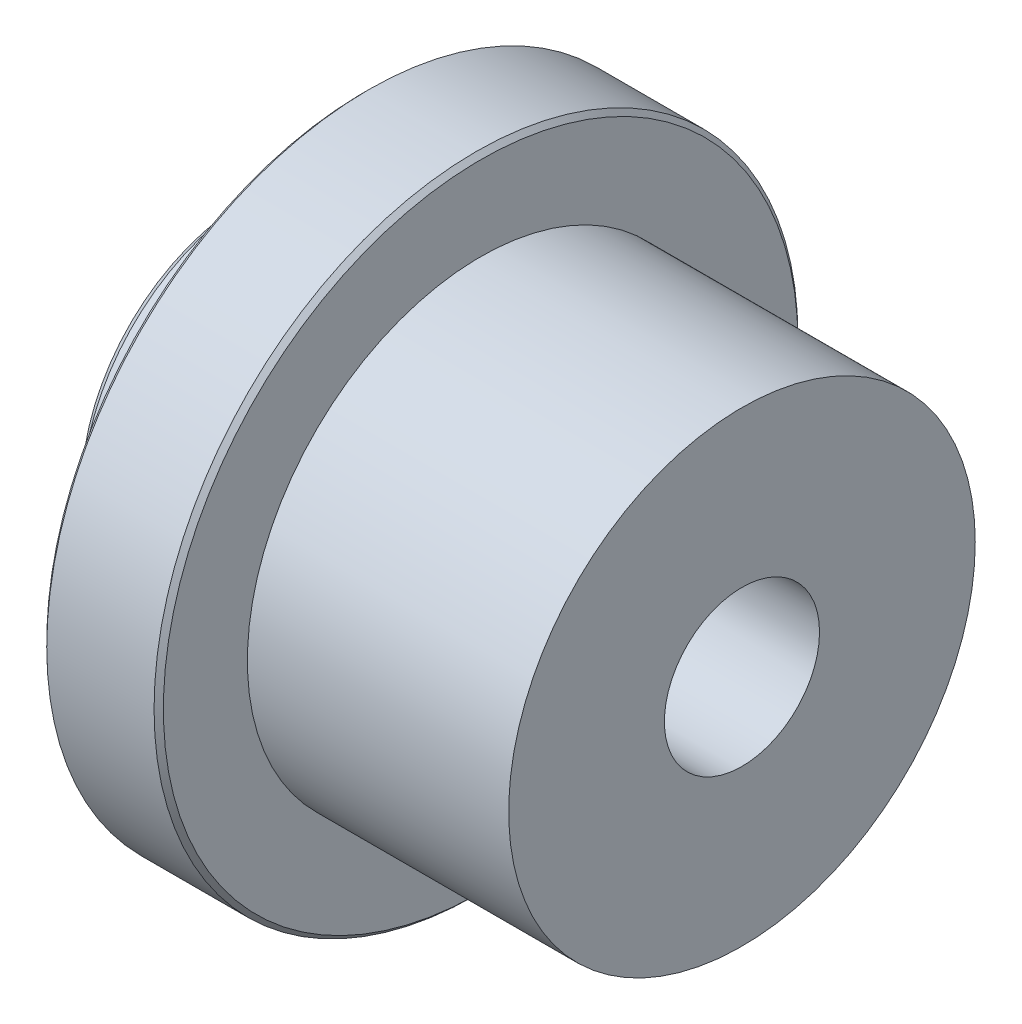
ISO-10303-21;
HEADER;
FILE_DESCRIPTION(('STEP AP214'),'2;1');
FILE_NAME('part.step','',(''),(''),'','','');
FILE_SCHEMA(('AUTOMOTIVE_DESIGN { 1 0 10303 214 1 1 1 1 }'));
ENDSEC;
DATA;
#1=APPLICATION_CONTEXT('core data for automotive mechanical design processes');
#2=APPLICATION_PROTOCOL_DEFINITION('international standard','automotive_design',2000,#1);
#3=PRODUCT_CONTEXT('',#1,'mechanical');
#4=PRODUCT('Part','Part','',(#3));
#5=PRODUCT_RELATED_PRODUCT_CATEGORY('part','',(#4));
#6=PRODUCT_DEFINITION_FORMATION('','',#4);
#7=PRODUCT_DEFINITION_CONTEXT('part definition',#1,'design');
#8=PRODUCT_DEFINITION('design','',#6,#7);
#9=PRODUCT_DEFINITION_SHAPE('','',#8);
#10=(LENGTH_UNIT() NAMED_UNIT(*) SI_UNIT(.MILLI.,.METRE.));
#11=(NAMED_UNIT(*) PLANE_ANGLE_UNIT() SI_UNIT($,.RADIAN.));
#12=(NAMED_UNIT(*) SI_UNIT($,.STERADIAN.) SOLID_ANGLE_UNIT());
#13=UNCERTAINTY_MEASURE_WITH_UNIT(LENGTH_MEASURE(1.E-05),#10,'distance_accuracy_value','');
#14=(GEOMETRIC_REPRESENTATION_CONTEXT(3) GLOBAL_UNCERTAINTY_ASSIGNED_CONTEXT((#13)) GLOBAL_UNIT_ASSIGNED_CONTEXT((#10,
#11,#12)) REPRESENTATION_CONTEXT('',''));
#15=CARTESIAN_POINT('',(0.,0.,0.));
#16=DIRECTION('',(0.,0.,1.));
#17=DIRECTION('',(1.,0.,0.));
#18=AXIS2_PLACEMENT_3D('',#15,#16,#17);
#19=CARTESIAN_POINT('',(6.35,0.,0.));
#20=DIRECTION('',(1.,0.,0.));
#21=DIRECTION('',(0.,0.,-1.));
#22=AXIS2_PLACEMENT_3D('',#19,#20,#21);
#23=PLANE('',#22);
#24=CARTESIAN_POINT('',(6.35,0.,0.));
#25=DIRECTION('',(1.,0.,0.));
#26=DIRECTION('',(0.,0.,-1.));
#27=AXIS2_PLACEMENT_3D('',#24,#25,#26);
#28=CIRCLE('',#27,12.7);
#29=CARTESIAN_POINT('',(6.35,0.,-12.7));
#30=VERTEX_POINT('',#29);
#31=EDGE_CURVE('E10',#30,#30,#28,.T.);
#32=ORIENTED_EDGE('',*,*,#31,.F.);
#33=EDGE_LOOP('',(#32));
#34=FACE_BOUND('',#33,.T.);
#35=CARTESIAN_POINT('',(6.35,0.,0.));
#36=DIRECTION('',(1.,0.,0.));
#37=DIRECTION('',(0.,0.,-1.));
#38=AXIS2_PLACEMENT_3D('',#35,#36,#37);
#39=CIRCLE('',#38,17.272);
#40=CARTESIAN_POINT('',(6.35,0.,-17.272));
#41=VERTEX_POINT('',#40);
#42=EDGE_CURVE('E79',#41,#41,#39,.T.);
#43=ORIENTED_EDGE('',*,*,#42,.T.);
#44=EDGE_LOOP('',(#43));
#45=FACE_BOUND('',#44,.T.);
#46=ADVANCED_FACE('F37',(#34,#45),#23,.T.);
#47=CARTESIAN_POINT('',(0.,0.,0.));
#48=DIRECTION('',(1.,0.,0.));
#49=DIRECTION('',(0.,0.,-1.));
#50=AXIS2_PLACEMENT_3D('',#47,#48,#49);
#51=PLANE('',#50);
#52=CARTESIAN_POINT('',(0.,0.,0.));
#53=DIRECTION('',(1.,0.,0.));
#54=DIRECTION('',(0.,0.,-1.));
#55=AXIS2_PLACEMENT_3D('',#52,#53,#54);
#56=CIRCLE('',#55,10.033);
#57=CARTESIAN_POINT('',(0.,0.,-10.033));
#58=VERTEX_POINT('',#57);
#59=EDGE_CURVE('E57',#58,#58,#56,.T.);
#60=ORIENTED_EDGE('',*,*,#59,.T.);
#61=EDGE_LOOP('',(#60));
#62=FACE_BOUND('',#61,.T.);
#63=CARTESIAN_POINT('',(0.,0.,0.));
#64=DIRECTION('',(1.,0.,0.));
#65=DIRECTION('',(0.,0.,-1.));
#66=AXIS2_PLACEMENT_3D('',#63,#64,#65);
#67=CIRCLE('',#66,17.272);
#68=CARTESIAN_POINT('',(0.,0.,-17.272));
#69=VERTEX_POINT('',#68);
#70=EDGE_CURVE('E95',#69,#69,#67,.F.);
#71=ORIENTED_EDGE('',*,*,#70,.T.);
#72=EDGE_LOOP('',(#71));
#73=FACE_BOUND('',#72,.T.);
#74=ADVANCED_FACE('F177',(#62,#73),#51,.F.);
#75=CARTESIAN_POINT('',(6.35,0.,0.));
#76=DIRECTION('',(-1.,0.,0.));
#77=DIRECTION('',(0.,0.,1.));
#78=AXIS2_PLACEMENT_3D('',#75,#76,#77);
#79=CYLINDRICAL_SURFACE('',#78,17.526);
#80=CARTESIAN_POINT('',(6.09600000000001,0.,0.));
#81=DIRECTION('',(1.,0.,0.));
#82=DIRECTION('',(0.,0.,-1.));
#83=AXIS2_PLACEMENT_3D('',#80,#81,#82);
#84=CIRCLE('',#83,17.526);
#85=CARTESIAN_POINT('',(6.09600000000001,0.,-17.526));
#86=VERTEX_POINT('',#85);
#87=EDGE_CURVE('E91',#86,#86,#84,.F.);
#88=ORIENTED_EDGE('',*,*,#87,.T.);
#89=EDGE_LOOP('',(#88));
#90=FACE_BOUND('',#89,.T.);
#91=CARTESIAN_POINT('',(0.254000000000008,0.,0.));
#92=DIRECTION('',(1.,0.,0.));
#93=DIRECTION('',(0.,0.,-1.));
#94=AXIS2_PLACEMENT_3D('',#91,#92,#93);
#95=CIRCLE('',#94,17.526);
#96=CARTESIAN_POINT('',(0.254000000000008,0.,-17.526));
#97=VERTEX_POINT('',#96);
#98=EDGE_CURVE('E87',#97,#97,#95,.T.);
#99=ORIENTED_EDGE('',*,*,#98,.T.);
#100=EDGE_LOOP('',(#99));
#101=FACE_BOUND('',#100,.T.);
#102=ADVANCED_FACE('F173',(#90,#101),#79,.T.);
#103=CARTESIAN_POINT('',(6.35,0.,0.));
#104=DIRECTION('',(-1.,0.,0.));
#105=DIRECTION('',(0.,0.,1.));
#106=AXIS2_PLACEMENT_3D('',#103,#104,#105);
#107=CYLINDRICAL_SURFACE('',#106,3.96875);
#108=CARTESIAN_POINT('',(6.096,0.,0.));
#109=DIRECTION('',(1.,0.,0.));
#110=DIRECTION('',(0.,0.,-1.));
#111=AXIS2_PLACEMENT_3D('',#108,#109,#110);
#112=CIRCLE('',#111,3.96875);
#113=CARTESIAN_POINT('',(6.096,0.,-3.96875));
#114=VERTEX_POINT('',#113);
#115=EDGE_CURVE('E75',#114,#114,#112,.T.);
#116=ORIENTED_EDGE('',*,*,#115,.T.);
#117=EDGE_LOOP('',(#116));
#118=FACE_BOUND('',#117,.T.);
#119=CARTESIAN_POINT('',(0.254000000000004,0.,0.));
#120=DIRECTION('',(1.,0.,0.));
#121=DIRECTION('',(0.,0.,-1.));
#122=AXIS2_PLACEMENT_3D('',#119,#120,#121);
#123=CIRCLE('',#122,3.96875);
#124=CARTESIAN_POINT('',(0.254000000000004,0.,-3.96875));
#125=VERTEX_POINT('',#124);
#126=EDGE_CURVE('E67',#125,#125,#123,.F.);
#127=ORIENTED_EDGE('',*,*,#126,.T.);
#128=EDGE_LOOP('',(#127));
#129=FACE_BOUND('',#128,.T.);
#130=ADVANCED_FACE('F169',(#118,#129),#107,.F.);
#131=CARTESIAN_POINT('',(6.096,0.,0.));
#132=DIRECTION('',(1.,0.,0.));
#133=DIRECTION('',(0.,0.,-1.));
#134=AXIS2_PLACEMENT_3D('',#131,#132,#133);
#135=CONICAL_SURFACE('',#134,3.96875,0.785398163397448);
#136=CARTESIAN_POINT('',(6.35,0.,0.));
#137=DIRECTION('',(1.,0.,0.));
#138=DIRECTION('',(0.,0.,-1.));
#139=AXIS2_PLACEMENT_3D('',#136,#137,#138);
#140=CIRCLE('',#139,4.22275);
#141=CARTESIAN_POINT('',(6.35,0.,-4.22275));
#142=VERTEX_POINT('',#141);
#143=EDGE_CURVE('E83',#142,#142,#140,.F.);
#144=ORIENTED_EDGE('',*,*,#143,.F.);
#145=EDGE_LOOP('',(#144));
#146=FACE_BOUND('',#145,.T.);
#147=ORIENTED_EDGE('',*,*,#115,.F.);
#148=EDGE_LOOP('',(#147));
#149=FACE_BOUND('',#148,.T.);
#150=ADVANCED_FACE('F172',(#146,#149),#135,.F.);
#151=CARTESIAN_POINT('',(6.35,0.,0.));
#152=DIRECTION('',(-1.,0.,0.));
#153=DIRECTION('',(0.,0.,1.));
#154=AXIS2_PLACEMENT_3D('',#151,#152,#153);
#155=CONICAL_SURFACE('',#154,17.272,0.785398163397455);
#156=ORIENTED_EDGE('',*,*,#87,.F.);
#157=EDGE_LOOP('',(#156));
#158=FACE_BOUND('',#157,.T.);
#159=ORIENTED_EDGE('',*,*,#42,.F.);
#160=EDGE_LOOP('',(#159));
#161=FACE_BOUND('',#160,.T.);
#162=ADVANCED_FACE('F187',(#158,#161),#155,.T.);
#163=CARTESIAN_POINT('',(0.,0.,0.));
#164=DIRECTION('',(-1.,0.,0.));
#165=DIRECTION('',(0.,0.,1.));
#166=AXIS2_PLACEMENT_3D('',#163,#164,#165);
#167=CONICAL_SURFACE('',#166,4.22275,0.785398163397435);
#168=ORIENTED_EDGE('',*,*,#126,.F.);
#169=EDGE_LOOP('',(#168));
#170=FACE_BOUND('',#169,.T.);
#171=CARTESIAN_POINT('',(0.,0.,0.));
#172=DIRECTION('',(1.,0.,0.));
#173=DIRECTION('',(0.,0.,-1.));
#174=AXIS2_PLACEMENT_3D('',#171,#172,#173);
#175=CIRCLE('',#174,4.22275);
#176=CARTESIAN_POINT('',(0.,0.,-4.22275));
#177=VERTEX_POINT('',#176);
#178=EDGE_CURVE('E99',#177,#177,#175,.T.);
#179=ORIENTED_EDGE('',*,*,#178,.F.);
#180=EDGE_LOOP('',(#179));
#181=FACE_BOUND('',#180,.T.);
#182=ADVANCED_FACE('F191',(#170,#181),#167,.F.);
#183=CARTESIAN_POINT('',(0.254000000000008,0.,0.));
#184=DIRECTION('',(1.,0.,0.));
#185=DIRECTION('',(0.,0.,-1.));
#186=AXIS2_PLACEMENT_3D('',#183,#184,#185);
#187=CONICAL_SURFACE('',#186,17.526,0.785398163397442);
#188=ORIENTED_EDGE('',*,*,#70,.F.);
#189=EDGE_LOOP('',(#188));
#190=FACE_BOUND('',#189,.T.);
#191=ORIENTED_EDGE('',*,*,#98,.F.);
#192=EDGE_LOOP('',(#191));
#193=FACE_BOUND('',#192,.T.);
#194=ADVANCED_FACE('F163',(#190,#193),#187,.T.);
#195=CARTESIAN_POINT('',(0.,0.,0.));
#196=DIRECTION('',(-1.,0.,0.));
#197=DIRECTION('',(0.,0.,1.));
#198=AXIS2_PLACEMENT_3D('',#195,#196,#197);
#199=PLANE('',#198);
#200=CARTESIAN_POINT('',(0.,0.,0.));
#201=DIRECTION('',(-1.,0.,0.));
#202=DIRECTION('',(0.,0.,1.));
#203=AXIS2_PLACEMENT_3D('',#200,#201,#202);
#204=CIRCLE('',#203,3.96875);
#205=CARTESIAN_POINT('',(0.,0.,3.96875));
#206=VERTEX_POINT('',#205);
#207=EDGE_CURVE('E68',#206,#206,#204,.T.);
#208=ORIENTED_EDGE('',*,*,#207,.T.);
#209=EDGE_LOOP('',(#208));
#210=FACE_BOUND('',#209,.T.);
#211=ORIENTED_EDGE('',*,*,#178,.T.);
#212=EDGE_LOOP('',(#211));
#213=FACE_BOUND('',#212,.T.);
#214=ADVANCED_FACE('F160',(#210,#213),#199,.F.);
#215=CARTESIAN_POINT('',(-6.35,0.,0.));
#216=DIRECTION('',(-1.,0.,0.));
#217=DIRECTION('',(0.,0.,1.));
#218=AXIS2_PLACEMENT_3D('',#215,#216,#217);
#219=PLANE('',#218);
#220=CARTESIAN_POINT('',(-6.35,0.,0.));
#221=DIRECTION('',(-1.,0.,0.));
#222=DIRECTION('',(0.,0.,1.));
#223=AXIS2_PLACEMENT_3D('',#220,#221,#222);
#224=CIRCLE('',#223,9.01699999999999);
#225=CARTESIAN_POINT('',(-6.35,0.,9.01699999999999));
#226=VERTEX_POINT('',#225);
#227=EDGE_CURVE('E51',#226,#226,#224,.T.);
#228=ORIENTED_EDGE('',*,*,#227,.T.);
#229=EDGE_LOOP('',(#228));
#230=FACE_BOUND('',#229,.T.);
#231=CARTESIAN_POINT('',(-6.35,0.,0.));
#232=DIRECTION('',(-1.,0.,0.));
#233=DIRECTION('',(0.,0.,1.));
#234=AXIS2_PLACEMENT_3D('',#231,#232,#233);
#235=CIRCLE('',#234,3.96875);
#236=CARTESIAN_POINT('',(-6.35,0.,3.96875));
#237=VERTEX_POINT('',#236);
#238=EDGE_CURVE('E63',#237,#237,#235,.T.);
#239=ORIENTED_EDGE('',*,*,#238,.F.);
#240=EDGE_LOOP('',(#239));
#241=FACE_BOUND('',#240,.T.);
#242=ADVANCED_FACE('F157',(#230,#241),#219,.T.);
#243=CARTESIAN_POINT('',(-6.35,0.,0.));
#244=DIRECTION('',(1.,0.,0.));
#245=DIRECTION('',(0.,0.,-1.));
#246=AXIS2_PLACEMENT_3D('',#243,#244,#245);
#247=CYLINDRICAL_SURFACE('',#246,9.525);
#248=CARTESIAN_POINT('',(-5.1435,0.,-9.525));
#249=CARTESIAN_POINT('',(-5.14349607279799,-0.109325214780728,-9.52499797722317));
#250=CARTESIAN_POINT('',(-5.1343617905558,-0.218699298836232,-9.52309854269612));
#251=CARTESIAN_POINT('',(-5.09809809841477,-0.434350648157332,-9.5157046184378));
#252=CARTESIAN_POINT('',(-5.07095489010668,-0.540625473543395,-9.51020737211297));
#253=CARTESIAN_POINT('',(-4.99955190980555,-0.746929638727985,-9.49623105896212));
#254=CARTESIAN_POINT('',(-4.95530905012875,-0.846965036417708,-9.48775493912347));
#255=CARTESIAN_POINT('',(-4.8510141235983,-1.03818724349356,-9.46874001328564));
#256=CARTESIAN_POINT('',(-4.79096281211621,-1.12937447538468,-9.45820130584877));
#257=CARTESIAN_POINT('',(-4.65583860180821,-1.30163189165895,-9.43604939541512));
#258=CARTESIAN_POINT('',(-4.58058172409254,-1.38255621248373,-9.4244240736427));
#259=CARTESIAN_POINT('',(-4.41757796600435,-1.53072703086181,-9.40149637536172));
#260=CARTESIAN_POINT('',(-4.32983006498443,-1.5979724096106,-9.39019402533403));
#261=CARTESIAN_POINT('',(-4.14327572855011,-1.71750521844225,-9.36907324988776));
#262=CARTESIAN_POINT('',(-4.04436965569054,-1.76964014048046,-9.3592703960289));
#263=CARTESIAN_POINT('',(-3.83896505248921,-1.85649467132888,-9.34243130041478));
#264=CARTESIAN_POINT('',(-3.73246732763011,-1.89121612459547,-9.33539476566461));
#265=CARTESIAN_POINT('',(-3.51647642278847,-1.94178160183454,-9.3250079195152));
#266=CARTESIAN_POINT('',(-3.40704580689552,-1.95788236741264,-9.32160752376978));
#267=CARTESIAN_POINT('',(-3.1869877593021,-1.97154718649839,-9.31872732903828));
#268=CARTESIAN_POINT('',(-3.07636045979744,-1.9691132670383,-9.31924710132582));
#269=CARTESIAN_POINT('',(-2.85893812644247,-1.94598504840487,-9.32410306524923));
#270=CARTESIAN_POINT('',(-2.75211005378221,-1.92558641761805,-9.32837745929926));
#271=CARTESIAN_POINT('',(-2.54342583106166,-1.86757511730737,-9.34016360825919));
#272=CARTESIAN_POINT('',(-2.44156993319712,-1.8299615756207,-9.3476755271914));
#273=CARTESIAN_POINT('',(-2.24487654335389,-1.73830961572463,-9.36515271052627));
#274=CARTESIAN_POINT('',(-2.15009468519981,-1.68415522328721,-9.37513520013501));
#275=CARTESIAN_POINT('',(-1.97085316324004,-1.56104053450099,-9.39641786552147));
#276=CARTESIAN_POINT('',(-1.88639476457072,-1.49207842632082,-9.40771820247001));
#277=CARTESIAN_POINT('',(-1.72849284794407,-1.3397290414665,-9.43063013542355));
#278=CARTESIAN_POINT('',(-1.6552925456406,-1.25608973236155,-9.44224353670682));
#279=CARTESIAN_POINT('',(-1.52392095874165,-1.0775944791829,-9.46427433422189));
#280=CARTESIAN_POINT('',(-1.46574989277672,-0.982738371967515,-9.4746917130539));
#281=CARTESIAN_POINT('',(-1.36603785684318,-0.784222745676314,-9.49318503674092));
#282=CARTESIAN_POINT('',(-1.32452609540191,-0.680548147507974,-9.50125686239469));
#283=CARTESIAN_POINT('',(-1.25957792041958,-0.467492111943824,-9.51411858928004));
#284=CARTESIAN_POINT('',(-1.23613916592496,-0.358111415605513,-9.51890891554746));
#285=CARTESIAN_POINT('',(-1.20834993707319,-0.138836813209462,-9.52460825821475));
#286=CARTESIAN_POINT('',(-1.20366683325757,-0.0289867671589367,-9.52558490197956));
#287=CARTESIAN_POINT('',(-1.21262403416182,0.189926073764649,-9.52373525753701));
#288=CARTESIAN_POINT('',(-1.22626323565332,0.298988915639572,-9.52090919829918));
#289=CARTESIAN_POINT('',(-1.27120169444096,0.512148314298206,-9.5118141298657));
#290=CARTESIAN_POINT('',(-1.3023289636707,0.61628268713774,-9.5055786665379));
#291=CARTESIAN_POINT('',(-1.38117100537708,0.817853472166442,-9.49036178083388));
#292=CARTESIAN_POINT('',(-1.4288870820216,0.915289357016741,-9.4813801425674));
#293=CARTESIAN_POINT('',(-1.5402626239938,1.10209069136893,-9.46149924438683));
#294=CARTESIAN_POINT('',(-1.60412067307946,1.19133520278028,-9.45057664388468));
#295=CARTESIAN_POINT('',(-1.74570310603602,1.3579611009551,-9.42807766096255));
#296=CARTESIAN_POINT('',(-1.82342908479446,1.43534112133219,-9.4165012034502));
#297=CARTESIAN_POINT('',(-1.99205962774303,1.57733620167181,-9.3937693184835));
#298=CARTESIAN_POINT('',(-2.08315865495483,1.64172219823569,-9.38262385231622));
#299=CARTESIAN_POINT('',(-2.27507366815292,1.75427993978499,-9.36223329538877));
#300=CARTESIAN_POINT('',(-2.37588925231114,1.80245235491304,-9.35298812609133));
#301=CARTESIAN_POINT('',(-2.58385393083314,1.88090961040677,-9.33752670256864));
#302=CARTESIAN_POINT('',(-2.69096560970807,1.91129028146396,-9.33129425343324));
#303=CARTESIAN_POINT('',(-2.90891708421236,1.95358915109126,-9.32253127940933));
#304=CARTESIAN_POINT('',(-3.0197563539588,1.96550994288242,-9.32000023455491));
#305=CARTESIAN_POINT('',(-3.23971361114068,1.97044964547399,-9.31895687701793));
#306=CARTESIAN_POINT('',(-3.3488232549276,1.96383091674554,-9.32036752151867));
#307=CARTESIAN_POINT('',(-3.56433746489594,1.93268278189076,-9.32687573391707));
#308=CARTESIAN_POINT('',(-3.67074205615009,1.90815354183695,-9.3319732676286));
#309=CARTESIAN_POINT('',(-3.87757530869718,1.84204706223161,-9.34524535546759));
#310=CARTESIAN_POINT('',(-3.9780196779732,1.80051714162707,-9.35341136380084));
#311=CARTESIAN_POINT('',(-4.17057073072857,1.70163099091131,-9.37190461402269));
#312=CARTESIAN_POINT('',(-4.26267665422888,1.64427332015879,-9.38223205262391));
#313=CARTESIAN_POINT('',(-4.43773443483714,1.51413459149824,-9.40411832283064));
#314=CARTESIAN_POINT('',(-4.52049029682386,1.44109302049258,-9.41569606831887));
#315=CARTESIAN_POINT('',(-4.67269007965167,1.28219439498359,-9.43864575649097));
#316=CARTESIAN_POINT('',(-4.74213093293424,1.1963343954097,-9.45001765120506));
#317=CARTESIAN_POINT('',(-4.86647514525719,1.01306756229291,-9.47142637051746));
#318=CARTESIAN_POINT('',(-4.92120515713305,0.915541089804446,-9.48144663632648));
#319=CARTESIAN_POINT('',(-5.01341143101104,0.712492370235797,-9.49885913379913));
#320=CARTESIAN_POINT('',(-5.05090287332741,0.606977253716624,-9.50625367636716));
#321=CARTESIAN_POINT('',(-5.10050587325669,0.41772414263567,-9.51618529088229));
#322=CARTESIAN_POINT('',(-5.11659923888832,0.335045862669027,-9.51947107568614));
#323=CARTESIAN_POINT('',(-5.1380976217874,0.168254670086087,-9.52387916984359));
#324=CARTESIAN_POINT('',(-5.14350302255873,0.0841418090544404,-9.52500155682385));
#325=CARTESIAN_POINT('',(-5.1435,0.,-9.525));
#326=B_SPLINE_CURVE_WITH_KNOTS('',3,(#248,#249,#250,#251,#252,#253,#254,#255,#256,#257,#258,
#259,#260,#261,#262,#263,#264,#265,#266,#267,#268,#269,#270,#271,#272,#273,#274,#275,#276,#277,
#278,#279,#280,#281,#282,#283,#284,#285,#286,#287,#288,#289,#290,#291,#292,#293,#294,#295,#296,
#297,#298,#299,#300,#301,#302,#303,#304,#305,#306,#307,#308,#309,#310,#311,#312,#313,#314,#315,
#316,#317,#318,#319,#320,#321,#322,#323,#324,#325),.UNSPECIFIED.,.T.,.F.,(4,2,2,2,2,2,2,2,2,2,2,
2,2,2,2,2,2,2,2,2,2,2,2,2,2,2,2,2,2,2,2,2,2,2,2,2,2,2,4),(0.,0.327667768179968,
0.655586885235371,0.983182502234619,1.31076246864947,1.64257292317095,1.97441050566017,
2.30948912409696,2.64453224308766,2.97489854806906,3.30522872330021,3.6302217528073,
3.95523124933027,4.28257395972369,4.60995674571746,4.94363894433683,5.27732599676314,
5.61159556854535,5.94582183590939,6.27409366814787,6.60234573526607,6.9274247048188,
7.25252923699617,7.58184650293843,7.91120166660335,8.2459346993441,8.58065389514007,
8.91355322323134,9.24640578179243,9.57279828419322,9.89918776020729,10.2246748890444,
10.5501916534867,10.8816037039026,11.2130920146962,11.54833039464,11.8832729950219,
12.1354705157374,12.3876589869771),.UNSPECIFIED.);
#327=CARTESIAN_POINT('',(-5.1435,0.,-9.525));
#328=VERTEX_POINT('',#327);
#329=EDGE_CURVE('E140',#328,#328,#326,.T.);
#330=ORIENTED_EDGE('',*,*,#329,.T.);
#331=EDGE_LOOP('',(#330));
#332=FACE_BOUND('',#331,.T.);
#333=CARTESIAN_POINT('',(-0.508,0.,0.));
#334=DIRECTION('',(1.,0.,0.));
#335=DIRECTION('',(0.,0.,-1.));
#336=AXIS2_PLACEMENT_3D('',#333,#334,#335);
#337=CIRCLE('',#336,9.525);
#338=CARTESIAN_POINT('',(-0.508,0.,-9.525));
#339=VERTEX_POINT('',#338);
#340=EDGE_CURVE('E107',#339,#339,#337,.F.);
#341=ORIENTED_EDGE('',*,*,#340,.T.);
#342=EDGE_LOOP('',(#341));
#343=FACE_BOUND('',#342,.T.);
#344=CARTESIAN_POINT('',(-5.84199999999999,0.,0.));
#345=DIRECTION('',(-1.,0.,0.));
#346=DIRECTION('',(0.,0.,1.));
#347=AXIS2_PLACEMENT_3D('',#344,#345,#346);
#348=CIRCLE('',#347,9.525);
#349=CARTESIAN_POINT('',(-5.84199999999999,0.,9.525));
#350=VERTEX_POINT('',#349);
#351=EDGE_CURVE('E103',#350,#350,#348,.F.);
#352=ORIENTED_EDGE('',*,*,#351,.T.);
#353=EDGE_LOOP('',(#352));
#354=FACE_BOUND('',#353,.T.);
#355=ADVANCED_FACE('F155',(#332,#343,#354),#247,.T.);
#356=CARTESIAN_POINT('',(-6.35,0.,0.));
#357=DIRECTION('',(1.,0.,0.));
#358=DIRECTION('',(0.,0.,-1.));
#359=AXIS2_PLACEMENT_3D('',#356,#357,#358);
#360=CYLINDRICAL_SURFACE('',#359,3.96875);
#361=CARTESIAN_POINT('',(-5.1435,0.,-3.96875));
#362=CARTESIAN_POINT('',(-5.14349356670163,-0.103586948965342,-3.9687444370505));
#363=CARTESIAN_POINT('',(-5.13527546053186,-0.207300346524305,-3.96465082204603));
#364=CARTESIAN_POINT('',(-5.1027635302155,-0.411668102562485,-3.94867872242792));
#365=CARTESIAN_POINT('',(-5.07843853453221,-0.512316132810073,-3.93678514303273));
#366=CARTESIAN_POINT('',(-5.01489494021505,-0.707283661654947,-3.90645925710804));
#367=CARTESIAN_POINT('',(-4.97573391131136,-0.801625984921552,-3.88805224328938));
#368=CARTESIAN_POINT('',(-4.88392476111263,-0.9822644268402,-3.84639287237268));
#369=CARTESIAN_POINT('',(-4.83127784423612,-1.06856126309276,-3.82314094800597));
#370=CARTESIAN_POINT('',(-4.7104073066822,-1.23646608662725,-3.77230381646582));
#371=CARTESIAN_POINT('',(-4.64144035761531,-1.31748490350687,-3.74454261056383));
#372=CARTESIAN_POINT('',(-4.49148597792487,-1.46734723274479,-3.68839868088376));
#373=CARTESIAN_POINT('',(-4.41048962674627,-1.53618162584557,-3.66001550930902));
#374=CARTESIAN_POINT('',(-4.23138829167487,-1.66496332902573,-3.60335864224418));
#375=CARTESIAN_POINT('',(-4.13245088737398,-1.72383763638134,-3.57525720744045));
#376=CARTESIAN_POINT('',(-3.92453391916233,-1.8238618862388,-3.52528744215357));
#377=CARTESIAN_POINT('',(-3.81556151011107,-1.86502434013875,-3.50341471550656));
#378=CARTESIAN_POINT('',(-3.59728371225459,-1.92580384416818,-3.47035975527868));
#379=CARTESIAN_POINT('',(-3.48838319689491,-1.94655620822428,-3.45861931547005));
#380=CARTESIAN_POINT('',(-3.26806547964832,-1.96940708631216,-3.44566469421814));
#381=CARTESIAN_POINT('',(-3.15665079721891,-1.97152350991728,-3.4444404065352));
#382=CARTESIAN_POINT('',(-2.94850304843841,-1.95787620402069,-3.45220600939688));
#383=CARTESIAN_POINT('',(-2.85157979326975,-1.94417914358424,-3.46001550867032));
#384=CARTESIAN_POINT('',(-2.66164377417602,-1.9028683222268,-3.4829040549384));
#385=CARTESIAN_POINT('',(-2.56863223278612,-1.87525024505221,-3.49798535651445));
#386=CARTESIAN_POINT('',(-2.38650805655245,-1.80637178859798,-3.5340531603629));
#387=CARTESIAN_POINT('',(-2.29753688815717,-1.76480834687777,-3.55516914648542));
#388=CARTESIAN_POINT('',(-2.12740770841982,-1.66945004500339,-3.6009314359028));
#389=CARTESIAN_POINT('',(-2.04625322521398,-1.61564969808957,-3.62557932098373));
#390=CARTESIAN_POINT('',(-1.88342273010157,-1.48953074093249,-3.67933841639752));
#391=CARTESIAN_POINT('',(-1.80293994792066,-1.41574046192797,-3.70862324148411));
#392=CARTESIAN_POINT('',(-1.65499921317981,-1.25558001828247,-3.76586357357019));
#393=CARTESIAN_POINT('',(-1.58754729657038,-1.1692040562421,-3.79381846003937));
#394=CARTESIAN_POINT('',(-1.46473581671618,-0.981390222476613,-3.84678803639826));
#395=CARTESIAN_POINT('',(-1.41005742394017,-0.879449305892019,-3.87161368129281));
#396=CARTESIAN_POINT('',(-1.31907049538692,-0.666272019633693,-3.91392752609067));
#397=CARTESIAN_POINT('',(-1.28274759247991,-0.555042999617852,-3.93142146280076));
#398=CARTESIAN_POINT('',(-1.23244991500054,-0.33622030448925,-3.95588753687627));
#399=CARTESIAN_POINT('',(-1.21688789071411,-0.229075489623684,-3.9636043369053));
#400=CARTESIAN_POINT('',(-1.20358813015335,-0.0134328823861218,-3.97019021286534));
#401=CARTESIAN_POINT('',(-1.2058421494702,0.0950642609883372,-3.96906338120582));
#402=CARTESIAN_POINT('',(-1.22717980378682,0.301567713220582,-3.95852466536707));
#403=CARTESIAN_POINT('',(-1.24497136148058,0.39974464345106,-3.9497489573531));
#404=CARTESIAN_POINT('',(-1.29486449818525,0.591526371244355,-3.92561059171494));
#405=CARTESIAN_POINT('',(-1.32696766618904,0.685130659834002,-3.91024720267936));
#406=CARTESIAN_POINT('',(-1.40543389419673,0.868239515701934,-3.87377199466203));
#407=CARTESIAN_POINT('',(-1.4521825086115,0.9575472251567,-3.85250677723876));
#408=CARTESIAN_POINT('',(-1.55818031917806,1.12734907130154,-3.80628644975206));
#409=CARTESIAN_POINT('',(-1.61743487604922,1.20783940584261,-3.78132975870141));
#410=CARTESIAN_POINT('',(-1.75339961710998,1.36599719251299,-3.72728734767594));
#411=CARTESIAN_POINT('',(-1.8312454365583,1.4426335981011,-3.69803592528217));
#412=CARTESIAN_POINT('',(-1.99877871562369,1.58221197444083,-3.64050722384814));
#413=CARTESIAN_POINT('',(-2.08847398121814,1.6451448448016,-3.61223060259004));
#414=CARTESIAN_POINT('',(-2.28243028621838,1.75826140674263,-3.55859507402713));
#415=CARTESIAN_POINT('',(-2.38717374101649,1.80771901500608,-3.53343213777923));
#416=CARTESIAN_POINT('',(-2.60514890473756,1.88777571446729,-3.49132585601121));
#417=CARTESIAN_POINT('',(-2.71836964338066,1.91839872169546,-3.47437209239401));
#418=CARTESIAN_POINT('',(-2.93851402603766,1.95712497940012,-3.45269268146212));
#419=CARTESIAN_POINT('',(-3.04500689268617,1.96709908593853,-3.44695413650429));
#420=CARTESIAN_POINT('',(-3.25824836075869,1.96962340100957,-3.4455143839148));
#421=CARTESIAN_POINT('',(-3.36499683905936,1.96218077047267,-3.44980905110426));
#422=CARTESIAN_POINT('',(-3.56533258325254,1.93182474293199,-3.46688343541159));
#423=CARTESIAN_POINT('',(-3.65922473799233,1.91040391145591,-3.47884272963283));
#424=CARTESIAN_POINT('',(-3.8419871229299,1.8545237445117,-3.50894848020227));
#425=CARTESIAN_POINT('',(-3.93085574683364,1.82006026540815,-3.52709690264861));
#426=CARTESIAN_POINT('',(-4.10765693840463,1.73647385787201,-3.56902734323262));
#427=CARTESIAN_POINT('',(-4.19512471202456,1.68652099887498,-3.59310612605432));
#428=CARTESIAN_POINT('',(-4.36100484472037,1.57430119633788,-3.64367111658586));
#429=CARTESIAN_POINT('',(-4.43941250282635,1.51202790520962,-3.67015856144109));
#430=CARTESIAN_POINT('',(-4.59463401803744,1.36825041032393,-3.72632546924178));
#431=CARTESIAN_POINT('',(-4.67015076359998,1.28534020903244,-3.75601013607942));
#432=CARTESIAN_POINT('',(-4.80648023612933,1.10717887904011,-3.81232909225427));
#433=CARTESIAN_POINT('',(-4.86728518370685,1.01192126190729,-3.83896176383915));
#434=CARTESIAN_POINT('',(-4.97243334191355,0.810668646231412,-3.88645554205161));
#435=CARTESIAN_POINT('',(-5.01668685947793,0.704618996010202,-3.90728505014087));
#436=CARTESIAN_POINT('',(-5.08616138172283,0.485380771842232,-3.94050490951639));
#437=CARTESIAN_POINT('',(-5.11143681551079,0.372213630402673,-3.95291938506466));
#438=CARTESIAN_POINT('',(-5.13220771007196,0.214925891904064,-3.96315937776242));
#439=CARTESIAN_POINT('',(-5.13643651759002,0.172084642383864,-3.9652505628345));
#440=CARTESIAN_POINT('',(-5.14208403932532,0.0861695615721994,-3.96804705014684));
#441=CARTESIAN_POINT('',(-5.14350267647279,0.0430957239344199,-3.96875231437781));
#442=CARTESIAN_POINT('',(-5.1435,0.,-3.96875));
#443=B_SPLINE_CURVE_WITH_KNOTS('',3,(#361,#362,#363,#364,#365,#366,#367,#368,#369,#370,#371,
#372,#373,#374,#375,#376,#377,#378,#379,#380,#381,#382,#383,#384,#385,#386,#387,#388,#389,#390,
#391,#392,#393,#394,#395,#396,#397,#398,#399,#400,#401,#402,#403,#404,#405,#406,#407,#408,#409,
#410,#411,#412,#413,#414,#415,#416,#417,#418,#419,#420,#421,#422,#423,#424,#425,#426,#427,#428,
#429,#430,#431,#432,#433,#434,#435,#436,#437,#438,#439,#440,#441,#442),.UNSPECIFIED.,.T.,.F.,(4,
2,2,2,2,2,2,2,2,2,2,2,2,2,2,2,2,2,2,2,2,2,2,2,2,2,2,2,2,2,2,2,2,2,2,2,2,2,2,2,4),(0.,
0.310585836866263,0.621774511736899,0.931767817476477,1.24173344750152,1.57023866257858,
1.89898871257522,2.25272371471573,2.60620843169925,2.93868017552778,3.27083237134463,
3.56405277639612,3.85736415130039,4.15751420095037,4.45779909752672,4.79547320483737,
5.13330335111434,5.48634374775245,5.83910738446372,6.16296724719735,6.48667725192708,
6.78578515871448,7.08492628319999,7.39271877028032,7.70064346271231,8.03843506981327,
8.37645032163539,8.73013183058619,9.08336330526793,9.40287158198936,9.72224851524889,
10.0121240572305,10.3020917697819,10.6115582442074,10.9211845754693,11.2676123657973,
11.6142229438025,11.9626855060003,12.3101448202759,12.4393556383073,12.5685699999351),.UNSPECIFIED.);
#444=CARTESIAN_POINT('',(-5.1435,0.,-3.96875));
#445=VERTEX_POINT('',#444);
#446=EDGE_CURVE('E41',#445,#445,#443,.T.);
#447=ORIENTED_EDGE('',*,*,#446,.F.);
#448=EDGE_LOOP('',(#447));
#449=FACE_BOUND('',#448,.T.);
#450=ORIENTED_EDGE('',*,*,#238,.T.);
#451=EDGE_LOOP('',(#450));
#452=FACE_BOUND('',#451,.T.);
#453=ORIENTED_EDGE('',*,*,#207,.F.);
#454=EDGE_LOOP('',(#453));
#455=FACE_BOUND('',#454,.T.);
#456=ADVANCED_FACE('F150',(#449,#452,#455),#360,.F.);
#457=CARTESIAN_POINT('',(-0.508,0.,0.));
#458=DIRECTION('',(1.,0.,0.));
#459=DIRECTION('',(0.,0.,-1.));
#460=AXIS2_PLACEMENT_3D('',#457,#458,#459);
#461=CONICAL_SURFACE('',#460,9.525,0.785398163397442);
#462=ORIENTED_EDGE('',*,*,#59,.F.);
#463=EDGE_LOOP('',(#462));
#464=FACE_BOUND('',#463,.T.);
#465=ORIENTED_EDGE('',*,*,#340,.F.);
#466=EDGE_LOOP('',(#465));
#467=FACE_BOUND('',#466,.T.);
#468=ADVANCED_FACE('F154',(#464,#467),#461,.T.);
#469=CARTESIAN_POINT('',(-6.35,0.,0.));
#470=DIRECTION('',(1.,0.,0.));
#471=DIRECTION('',(0.,0.,-1.));
#472=AXIS2_PLACEMENT_3D('',#469,#470,#471);
#473=CONICAL_SURFACE('',#472,9.01699999999999,0.785398163397448);
#474=ORIENTED_EDGE('',*,*,#351,.F.);
#475=EDGE_LOOP('',(#474));
#476=FACE_BOUND('',#475,.T.);
#477=ORIENTED_EDGE('',*,*,#227,.F.);
#478=EDGE_LOOP('',(#477));
#479=FACE_BOUND('',#478,.T.);
#480=ADVANCED_FACE('F39',(#476,#479),#473,.T.);
#481=CARTESIAN_POINT('',(20.574,0.,0.));
#482=DIRECTION('',(1.,0.,0.));
#483=DIRECTION('',(0.,0.,-1.));
#484=AXIS2_PLACEMENT_3D('',#481,#482,#483);
#485=PLANE('',#484);
#486=CARTESIAN_POINT('',(20.574,0.,0.));
#487=DIRECTION('',(1.,0.,0.));
#488=DIRECTION('',(0.,0.,-1.));
#489=AXIS2_PLACEMENT_3D('',#486,#487,#488);
#490=CIRCLE('',#489,12.7);
#491=CARTESIAN_POINT('',(20.574,0.,-12.7));
#492=VERTEX_POINT('',#491);
#493=EDGE_CURVE('E61',#492,#492,#490,.T.);
#494=ORIENTED_EDGE('',*,*,#493,.T.);
#495=EDGE_LOOP('',(#494));
#496=FACE_BOUND('',#495,.T.);
#497=CARTESIAN_POINT('',(20.574,0.,0.));
#498=DIRECTION('',(1.,0.,0.));
#499=DIRECTION('',(0.,0.,-1.));
#500=AXIS2_PLACEMENT_3D('',#497,#498,#499);
#501=CIRCLE('',#500,4.22275);
#502=CARTESIAN_POINT('',(20.574,0.,-4.22275));
#503=VERTEX_POINT('',#502);
#504=EDGE_CURVE('E236',#503,#503,#501,.T.);
#505=ORIENTED_EDGE('',*,*,#504,.F.);
#506=EDGE_LOOP('',(#505));
#507=FACE_BOUND('',#506,.T.);
#508=ADVANCED_FACE('F148',(#496,#507),#485,.T.);
#509=CARTESIAN_POINT('',(20.574,0.,0.));
#510=DIRECTION('',(-1.,0.,0.));
#511=DIRECTION('',(0.,0.,1.));
#512=AXIS2_PLACEMENT_3D('',#509,#510,#511);
#513=CYLINDRICAL_SURFACE('',#512,12.7);
#514=CARTESIAN_POINT('',(15.4305,0.,-12.7));
#515=CARTESIAN_POINT('',(15.4304955036949,0.109865514313857,-12.6999981997999));
#516=CARTESIAN_POINT('',(15.4212712559636,0.219793684362064,-12.6985594439578));
#517=CARTESIAN_POINT('',(15.3846290594047,0.436574333630027,-12.6929584524686));
#518=CARTESIAN_POINT('',(15.3571936803182,0.543423763793858,-12.6887936076772));
#519=CARTESIAN_POINT('',(15.2849712552229,0.750878567477832,-12.6782082151021));
#520=CARTESIAN_POINT('',(15.2401976375935,0.851488703510189,-12.6717894133545));
#521=CARTESIAN_POINT('',(15.1346032045913,1.0437533778636,-12.6574043647704));
#522=CARTESIAN_POINT('',(15.0737845034759,1.13540909392789,-12.6494383218499));
#523=CARTESIAN_POINT('',(14.9372874969292,1.30794027074403,-12.6327697398087));
#524=CARTESIAN_POINT('',(14.8615019885838,1.38873044074573,-12.6240621614858));
#525=CARTESIAN_POINT('',(14.6974533577055,1.53650105832632,-12.6069310945901));
#526=CARTESIAN_POINT('',(14.6091894983878,1.60348068988695,-12.5985076228287));
#527=CARTESIAN_POINT('',(14.4221128140228,1.72206382031676,-12.5828496469964));
#528=CARTESIAN_POINT('',(14.3232467499711,1.77358426404667,-12.5756216556566));
#529=CARTESIAN_POINT('',(14.1181335598533,1.85925567126197,-12.5632421615507));
#530=CARTESIAN_POINT('',(14.0118868640995,1.89340764641529,-12.5580905378453));
#531=CARTESIAN_POINT('',(13.7959275015933,1.94310665143581,-12.5504967975446));
#532=CARTESIAN_POINT('',(13.6862492862827,1.95880006897619,-12.5480333733169));
#533=CARTESIAN_POINT('',(13.4657906785988,1.97159008654187,-12.5460303322042));
#534=CARTESIAN_POINT('',(13.3550103541619,1.96868782584068,-12.5464905362017));
#535=CARTESIAN_POINT('',(13.1365294122286,1.9444883878434,-12.5502632782933));
#536=CARTESIAN_POINT('',(13.0288101903675,1.92335465505426,-12.5535504717182));
#537=CARTESIAN_POINT('',(12.8184653409387,1.86354822442177,-12.5625671940527));
#538=CARTESIAN_POINT('',(12.7158398664769,1.82487499973697,-12.5682967963259));
#539=CARTESIAN_POINT('',(12.5181006971432,1.73091862705284,-12.5815805717069));
#540=CARTESIAN_POINT('',(12.4230202369974,1.67556664283864,-12.5891422804052));
#541=CARTESIAN_POINT('',(12.2434350116248,1.5498729699544,-12.6052328718146));
#542=CARTESIAN_POINT('',(12.1589309874267,1.47953023190262,-12.6137618222149));
#543=CARTESIAN_POINT('',(12.0019504646205,1.32495657323922,-12.6309377034524));
#544=CARTESIAN_POINT('',(11.9296122136577,1.24058521158422,-12.639584920768));
#545=CARTESIAN_POINT('',(11.8001004892554,1.06082689051121,-12.6559384448542));
#546=CARTESIAN_POINT('',(11.7429270906242,0.96543987675624,-12.6636447469831));
#547=CARTESIAN_POINT('',(11.6453593272884,0.766235170480246,-12.6772570033331));
#548=CARTESIAN_POINT('',(11.6049760761408,0.66241194812225,-12.6831617644112));
#549=CARTESIAN_POINT('',(11.5422574686758,0.449345284055899,-12.6924957809617));
#550=CARTESIAN_POINT('',(11.5199208086844,0.340102234477541,-12.6959252152482));
#551=CARTESIAN_POINT('',(11.4941143062492,0.120489632791291,-12.6998983867774));
#552=CARTESIAN_POINT('',(11.4904544821406,0.0101429118848187,-12.7004711805371));
#553=CARTESIAN_POINT('',(11.5016006252552,-0.209588046116568,-12.69874576878));
#554=CARTESIAN_POINT('',(11.516405980868,-0.318972314969321,-12.6964476583542));
#555=CARTESIAN_POINT('',(11.5639042197999,-0.533094604722065,-12.6892566294704));
#556=CARTESIAN_POINT('',(11.59650411115,-0.637853745935723,-12.6843772046828));
#557=CARTESIAN_POINT('',(11.6785676571468,-0.840419489983639,-12.672568751864));
#558=CARTESIAN_POINT('',(11.7280321497241,-0.93822574706666,-12.6656396219939));
#559=CARTESIAN_POINT('',(11.8428634215127,-1.12494181868927,-12.6504291939649));
#560=CARTESIAN_POINT('',(11.90835018205,-1.21377701106489,-12.6421378565693));
#561=CARTESIAN_POINT('',(12.0532005977986,-1.3792643727547,-12.6251559516019));
#562=CARTESIAN_POINT('',(12.1325651172916,-1.45591578271702,-12.6164653591901));
#563=CARTESIAN_POINT('',(12.3037658068519,-1.59555476498417,-12.5995717625363));
#564=CARTESIAN_POINT('',(12.3957066662327,-1.65841468735293,-12.5913737849382));
#565=CARTESIAN_POINT('',(12.5889540726396,-1.76779783237121,-12.576484045671));
#566=CARTESIAN_POINT('',(12.6902603532639,-1.81432151952856,-12.569792241177));
#567=CARTESIAN_POINT('',(12.898989124923,-1.88951571004824,-12.5587093003297));
#568=CARTESIAN_POINT('',(13.006387324377,-1.91825233336516,-12.5543096531054));
#569=CARTESIAN_POINT('',(13.2245592175217,-1.95726645829483,-12.5482869082907));
#570=CARTESIAN_POINT('',(13.3353326602265,-1.96754532905127,-12.5466636047594));
#571=CARTESIAN_POINT('',(13.5558376153532,-1.9693179660754,-12.5463853814857));
#572=CARTESIAN_POINT('',(13.6655675262271,-1.96101249880955,-12.5476987369279));
#573=CARTESIAN_POINT('',(13.8820495033943,-1.92628357949096,-12.5530767336233));
#574=CARTESIAN_POINT('',(13.988801575786,-1.89986016454521,-12.5571413692416));
#575=CARTESIAN_POINT('',(14.1962355506132,-1.82971814574983,-12.5675525720855));
#576=CARTESIAN_POINT('',(14.296922623497,-1.78601452090653,-12.5738971625447));
#577=CARTESIAN_POINT('',(14.4895678945175,-1.68257280975499,-12.5881556540483));
#578=CARTESIAN_POINT('',(14.5815257567103,-1.62283410667482,-12.5960696154539));
#579=CARTESIAN_POINT('',(14.7551206787769,-1.48829228703719,-12.6126767393173));
#580=CARTESIAN_POINT('',(14.8366420366468,-1.4133407503593,-12.6213770698808));
#581=CARTESIAN_POINT('',(14.9860207216883,-1.25081450291435,-12.6385175613338));
#582=CARTESIAN_POINT('',(15.0538748760422,-1.16323686909832,-12.646957661427));
#583=CARTESIAN_POINT('',(15.1743533345231,-0.97733440870692,-12.6626838772782));
#584=CARTESIAN_POINT('',(15.2268854115877,-0.878949216852617,-12.6699628900294));
#585=CARTESIAN_POINT('',(15.3145991955925,-0.674683351054411,-12.6824773462502));
#586=CARTESIAN_POINT('',(15.3497986737202,-0.568810482206575,-12.6877148817017));
#587=CARTESIAN_POINT('',(15.3939620663029,-0.385400471898395,-12.694375846815));
#588=CARTESIAN_POINT('',(15.4076425641056,-0.308989209119151,-12.696473945735));
#589=CARTESIAN_POINT('',(15.4259130553959,-0.155062359168312,-12.6992866481548));
#590=CARTESIAN_POINT('',(15.4305031736439,-0.0775467871674445,-12.700001270642));
#591=CARTESIAN_POINT('',(15.4305,0.,-12.7));
#592=B_SPLINE_CURVE_WITH_KNOTS('',3,(#514,#515,#516,#517,#518,#519,#520,#521,#522,#523,#524,
#525,#526,#527,#528,#529,#530,#531,#532,#533,#534,#535,#536,#537,#538,#539,#540,#541,#542,#543,
#544,#545,#546,#547,#548,#549,#550,#551,#552,#553,#554,#555,#556,#557,#558,#559,#560,#561,#562,
#563,#564,#565,#566,#567,#568,#569,#570,#571,#572,#573,#574,#575,#576,#577,#578,#579,#580,#581,
#582,#583,#584,#585,#586,#587,#588,#589,#590,#591),.UNSPECIFIED.,.T.,.F.,(4,2,2,2,2,2,2,2,2,2,2,
2,2,2,2,2,2,2,2,2,2,2,2,2,2,2,2,2,2,2,2,2,2,2,2,2,2,2,4),(0.,0.329313152457267,
0.658941952854769,0.988315966345344,1.3176465999473,1.64942778367775,1.98122856562798,
2.31478129436106,2.64831459229302,2.97918453961978,3.31003421622799,3.63794830102221,
3.96587223616849,4.29516855346789,4.62448792972244,4.95732812541427,5.29016996297853,
5.62323176230088,5.95626949930618,6.2859127108869,6.61554500419542,6.94347094762034,
7.27141318667184,7.60189068564059,7.93238877348617,8.26582763945111,8.59925702357999,
8.93143938558516,9.2635971062277,9.59218387291294,9.92076996662859,10.2490718542683,
10.5773863714947,10.9090729020408,11.240836344518,11.5745573763901,11.9079355264873,
12.1403790516018,12.3728193865379),.UNSPECIFIED.);
#593=CARTESIAN_POINT('',(15.4305,0.,-12.7));
#594=VERTEX_POINT('',#593);
#595=EDGE_CURVE('E121',#594,#594,#592,.T.);
#596=ORIENTED_EDGE('',*,*,#595,.T.);
#597=EDGE_LOOP('',(#596));
#598=FACE_BOUND('',#597,.T.);
#599=ORIENTED_EDGE('',*,*,#493,.F.);
#600=EDGE_LOOP('',(#599));
#601=FACE_BOUND('',#600,.T.);
#602=ORIENTED_EDGE('',*,*,#31,.T.);
#603=EDGE_LOOP('',(#602));
#604=FACE_BOUND('',#603,.T.);
#605=ADVANCED_FACE('F145',(#598,#601,#604),#513,.T.);
#606=CARTESIAN_POINT('',(20.574,0.,0.));
#607=DIRECTION('',(-1.,0.,0.));
#608=DIRECTION('',(0.,0.,1.));
#609=AXIS2_PLACEMENT_3D('',#606,#607,#608);
#610=CYLINDRICAL_SURFACE('',#609,4.22275);
#611=CARTESIAN_POINT('',(15.4305,0.,-4.22275));
#612=CARTESIAN_POINT('',(15.4304943205287,0.104308646146083,-4.22274523327125));
#613=CARTESIAN_POINT('',(15.4221603498695,0.208765866616978,-4.21884253938063));
#614=CARTESIAN_POINT('',(15.3891688958771,0.414644512353485,-4.20361731237706));
#615=CARTESIAN_POINT('',(15.3644751800851,0.516058675753915,-4.19227831039531));
#616=CARTESIAN_POINT('',(15.2999110423612,0.712550321878574,-4.16337787613591));
#617=CARTESIAN_POINT('',(15.2600967663587,0.80764973608727,-4.14583948004447));
#618=CARTESIAN_POINT('',(15.1666871129904,0.989702230316183,-4.10619034025499));
#619=CARTESIAN_POINT('',(15.1130940648349,1.07665668380206,-4.08408036947504));
#620=CARTESIAN_POINT('',(14.9902954552435,1.24529983230145,-4.03595719529735));
#621=CARTESIAN_POINT('',(14.9203969883099,1.32644144121121,-4.0097967534196));
#622=CARTESIAN_POINT('',(14.7684495736813,1.47634155097698,-3.95706447074482));
#623=CARTESIAN_POINT('',(14.6863927083288,1.54509191739439,-3.93049237204648));
#624=CARTESIAN_POINT('',(14.5060262398588,1.67271667372877,-3.87797723480676));
#625=CARTESIAN_POINT('',(14.4070066535915,1.73065782743723,-3.85218753190863));
#626=CARTESIAN_POINT('',(14.1992738379047,1.82882266469498,-3.80657012500965));
#627=CARTESIAN_POINT('',(14.0905668382338,1.8690576372078,-3.78673862479309));
#628=CARTESIAN_POINT('',(13.8727961414668,1.92827514577461,-3.75691672035598));
#629=CARTESIAN_POINT('',(13.7640904408519,1.94831777806621,-3.74643916435217));
#630=CARTESIAN_POINT('',(13.5443943411407,1.96986298414139,-3.73516024609419));
#631=CARTESIAN_POINT('',(13.4334057842277,1.97137996158797,-3.73435136647206));
#632=CARTESIAN_POINT('',(13.2242542721082,1.95661584738609,-3.74209998910188));
#633=CARTESIAN_POINT('',(13.1259237430756,1.94210885332416,-3.74972396446635));
#634=CARTESIAN_POINT('',(12.9332968074024,1.89874072791942,-3.77186793935211));
#635=CARTESIAN_POINT('',(12.8390014410368,1.86987591902064,-3.78638970560431));
#636=CARTESIAN_POINT('',(12.6545010542482,1.79804601334591,-3.82102899199917));
#637=CARTESIAN_POINT('',(12.5644404180128,1.75477123732325,-3.84126778019024));
#638=CARTESIAN_POINT('',(12.3924565696115,1.6555769482478,-3.88505058625254));
#639=CARTESIAN_POINT('',(12.3105369335982,1.59965191326003,-3.90859604580434));
#640=CARTESIAN_POINT('',(12.1478189060864,1.46966098957174,-3.9594302665704));
#641=CARTESIAN_POINT('',(12.0681030502535,1.39428629603805,-3.98684824521903));
#642=CARTESIAN_POINT('',(11.9220285903623,1.23104900676386,-4.04023620678922));
#643=CARTESIAN_POINT('',(11.8556748547568,1.14318187925881,-4.06620565946155));
#644=CARTESIAN_POINT('',(11.7360421380236,0.953451973681525,-4.11490718286142));
#645=CARTESIAN_POINT('',(11.6833104033489,0.851203315654961,-4.13749174982887));
#646=CARTESIAN_POINT('',(11.5961935140941,0.637963342467506,-4.17568170938245));
#647=CARTESIAN_POINT('',(11.5617956355105,0.52697815216176,-4.19129194105394));
#648=CARTESIAN_POINT('',(11.5148350232887,0.308362331348494,-4.21279926055978));
#649=CARTESIAN_POINT('',(11.5008265085333,0.201105703912104,-4.2193377486526));
#650=CARTESIAN_POINT('',(11.4906021417607,-0.0144199025552766,-4.22409867702161));
#651=CARTESIAN_POINT('',(11.4943794048893,-0.122688473669076,-4.22232433518599));
#652=CARTESIAN_POINT('',(11.518689502158,-0.329677245304679,-4.21105467393155));
#653=CARTESIAN_POINT('',(11.5381121286592,-0.428559297539828,-4.20207108290274));
#654=CARTESIAN_POINT('',(11.5915047476464,-0.621500563436487,-4.17789577505326));
#655=CARTESIAN_POINT('',(11.6254764445159,-0.715559210603313,-4.162703330892));
#656=CARTESIAN_POINT('',(11.7080325353545,-0.899480350055402,-4.12693634196577));
#657=CARTESIAN_POINT('',(11.7570330757471,-0.98912572543082,-4.10621104363762));
#658=CARTESIAN_POINT('',(11.8678010295035,-1.15923956193016,-4.06146897293532));
#659=CARTESIAN_POINT('',(11.9295740531807,-1.23970396612819,-4.03745075571382));
#660=CARTESIAN_POINT('',(12.07041898132,-1.39662499742135,-3.9860327675329));
#661=CARTESIAN_POINT('',(12.150532575974,-1.47211212864482,-3.95852112592413));
#662=CARTESIAN_POINT('',(12.3225322669562,-1.60894059101308,-3.90491224745421));
#663=CARTESIAN_POINT('',(12.4144239171675,-1.67027521015648,-3.87881568618204));
#664=CARTESIAN_POINT('',(12.611243019792,-1.77882795740391,-3.83028035937802));
#665=CARTESIAN_POINT('',(12.7164950240659,-1.82552774745761,-3.80798648981402));
#666=CARTESIAN_POINT('',(12.9347505486972,-1.90006820997685,-3.77135417706826));
#667=CARTESIAN_POINT('',(13.0477453625037,-1.92792969436836,-3.75700695787492));
#668=CARTESIAN_POINT('',(13.2673429633957,-1.96171096619384,-3.73947014208534));
#669=CARTESIAN_POINT('',(13.3736053302734,-1.96938036777066,-3.73539229864768));
#670=CARTESIAN_POINT('',(13.5859150644656,-1.96745939358735,-3.73640553996589));
#671=CARTESIAN_POINT('',(13.6919624835145,-1.95787383503945,-3.74149406566973));
#672=CARTESIAN_POINT('',(13.8927856077037,-1.9232905890186,-3.75937510661314));
#673=CARTESIAN_POINT('',(13.9878207108783,-1.8994622552784,-3.77158153703645));
#674=CARTESIAN_POINT('',(14.1725001688012,-1.83838200124732,-3.80172623179542));
#675=CARTESIAN_POINT('',(14.2621429097956,-1.80112608562176,-3.81966620194763));
#676=CARTESIAN_POINT('',(14.4400158247285,-1.7114458603957,-3.8607190347587));
#677=CARTESIAN_POINT('',(14.5277596074043,-1.6581806553617,-3.88409572740683));
#678=CARTESIAN_POINT('',(14.6936022671744,-1.5390208436995,-3.93283287800147));
#679=CARTESIAN_POINT('',(14.7716966229329,-1.47312035330635,-3.95819425687063));
#680=CARTESIAN_POINT('',(14.9241173305371,-1.32279086183105,-4.0110846639982));
#681=CARTESIAN_POINT('',(14.9972849488545,-1.23716774180852,-4.03857669510818));
#682=CARTESIAN_POINT('',(15.1283883456721,-1.05395798788667,-4.09021246087567));
#683=CARTESIAN_POINT('',(15.1863168875681,-0.956365702307242,-4.11435460220366));
#684=CARTESIAN_POINT('',(15.2846448796638,-0.752151663736749,-4.15652437182666));
#685=CARTESIAN_POINT('',(15.3251388943685,-0.645582469267791,-4.17458486738571));
#686=CARTESIAN_POINT('',(15.3871564692353,-0.426232631355614,-4.20262726537646));
#687=CARTESIAN_POINT('',(15.4087365183903,-0.313471560193339,-4.21263321639095));
#688=CARTESIAN_POINT('',(15.4237294082485,-0.166520687197166,-4.21959780292007));
#689=CARTESIAN_POINT('',(15.426265626789,-0.133282998331388,-4.22077751557154));
#690=CARTESIAN_POINT('',(15.4296518474977,-0.066701939562149,-4.22235438406178));
#691=CARTESIAN_POINT('',(15.430501816331,-0.0333585675825212,-4.22275152443013));
#692=CARTESIAN_POINT('',(15.4305,0.,-4.22275));
#693=B_SPLINE_CURVE_WITH_KNOTS('',3,(#611,#612,#613,#614,#615,#616,#617,#618,#619,#620,#621,
#622,#623,#624,#625,#626,#627,#628,#629,#630,#631,#632,#633,#634,#635,#636,#637,#638,#639,#640,
#641,#642,#643,#644,#645,#646,#647,#648,#649,#650,#651,#652,#653,#654,#655,#656,#657,#658,#659,
#660,#661,#662,#663,#664,#665,#666,#667,#668,#669,#670,#671,#672,#673,#674,#675,#676,#677,#678,
#679,#680,#681,#682,#683,#684,#685,#686,#687,#688,#689,#690,#691,#692),.UNSPECIFIED.,.T.,.F.,(4,
2,2,2,2,2,2,2,2,2,2,2,2,2,2,2,2,2,2,2,2,2,2,2,2,2,2,2,2,2,2,2,2,2,2,2,2,2,2,2,4),(0.,
0.312789577274294,0.626274226008779,0.93860604240172,1.25088509583752,1.58022200064085,
1.9097743229055,2.26076203783387,2.61152564749578,2.9427273713877,3.27367157013121,
3.57134237862176,3.86908947066993,4.17369971611099,4.4784431837282,4.81619486721175,
5.15406938785615,5.50392839166831,5.85354427025814,6.17690470717216,6.50013998192728,
6.80226870043708,7.10443282218416,7.41586264003222,7.72742954515165,8.06630605688778,
8.4053429561147,8.75530046245475,9.10487071303322,9.42296849990724,9.74097749452117,
10.0359007394598,10.3309118104254,10.6454531782545,10.9601413731664,11.3063144471413,
11.652651613329,11.997085835163,12.3404878196677,12.4405179358027,12.5405500293839),.UNSPECIFIED.);
#694=CARTESIAN_POINT('',(15.4305,0.,-4.22275));
#695=VERTEX_POINT('',#694);
#696=EDGE_CURVE('E113',#695,#695,#693,.T.);
#697=ORIENTED_EDGE('',*,*,#696,.F.);
#698=EDGE_LOOP('',(#697));
#699=FACE_BOUND('',#698,.T.);
#700=ORIENTED_EDGE('',*,*,#504,.T.);
#701=EDGE_LOOP('',(#700));
#702=FACE_BOUND('',#701,.T.);
#703=ORIENTED_EDGE('',*,*,#143,.T.);
#704=EDGE_LOOP('',(#703));
#705=FACE_BOUND('',#704,.T.);
#706=ADVANCED_FACE('F122',(#699,#702,#705),#610,.F.);
#707=CARTESIAN_POINT('',(13.462,0.,-16.764));
#708=DIRECTION('',(0.,0.,1.));
#709=DIRECTION('',(1.,0.,0.));
#710=AXIS2_PLACEMENT_3D('',#707,#708,#709);
#711=CYLINDRICAL_SURFACE('',#710,1.9685);
#712=ORIENTED_EDGE('',*,*,#696,.T.);
#713=EDGE_LOOP('',(#712));
#714=FACE_BOUND('',#713,.T.);
#715=ORIENTED_EDGE('',*,*,#595,.F.);
#716=EDGE_LOOP('',(#715));
#717=FACE_BOUND('',#716,.T.);
#718=ADVANCED_FACE('F125',(#714,#717),#711,.F.);
#719=CARTESIAN_POINT('',(-3.175,0.,-16.764));
#720=DIRECTION('',(0.,0.,1.));
#721=DIRECTION('',(1.,0.,0.));
#722=AXIS2_PLACEMENT_3D('',#719,#720,#721);
#723=CYLINDRICAL_SURFACE('',#722,1.9685);
#724=ORIENTED_EDGE('',*,*,#446,.T.);
#725=EDGE_LOOP('',(#724));
#726=FACE_BOUND('',#725,.T.);
#727=ORIENTED_EDGE('',*,*,#329,.F.);
#728=EDGE_LOOP('',(#727));
#729=FACE_BOUND('',#728,.T.);
#730=ADVANCED_FACE('F128',(#726,#729),#723,.F.);
#731=CLOSED_SHELL('',(#46,#74,#102,#130,#150,#162,#182,#194,#214,#242,#355,#456,#468,#480,#508,
#605,#706,#718,#730));
#732=MANIFOLD_SOLID_BREP('B2',#731);
#733=ADVANCED_BREP_SHAPE_REPRESENTATION('',(#18,#732),#14);
#734=SHAPE_DEFINITION_REPRESENTATION(#9,#733);
ENDSEC;
END-ISO-10303-21;
